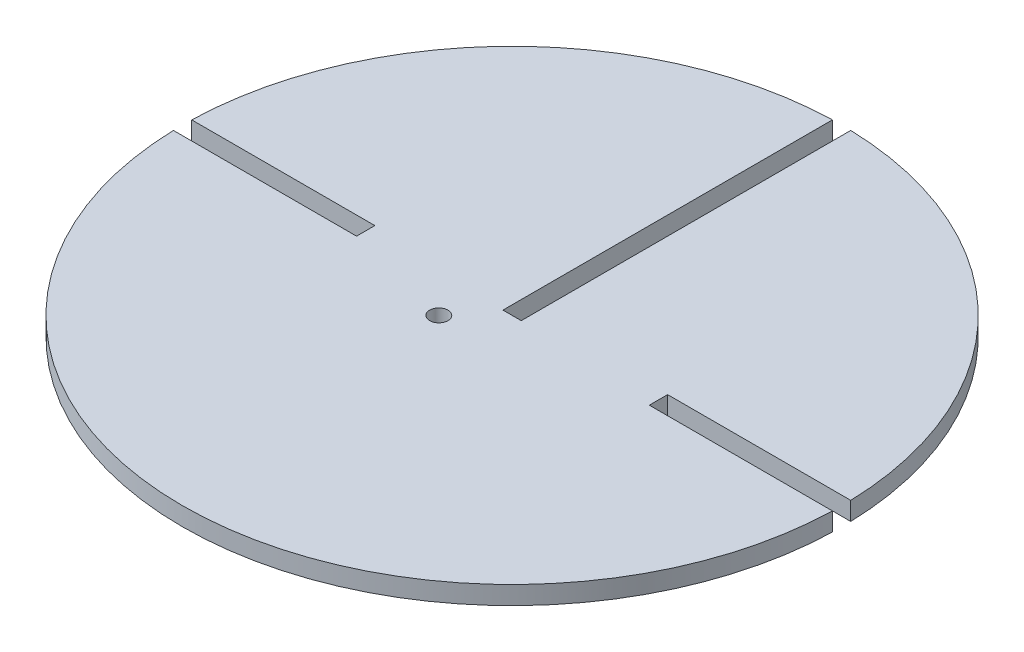
ISO-10303-21;
HEADER;
FILE_DESCRIPTION(('STEP AP214'),'2;1');
FILE_NAME('part.step','',(''),(''),'','','');
FILE_SCHEMA(('AUTOMOTIVE_DESIGN { 1 0 10303 214 1 1 1 1 }'));
ENDSEC;
DATA;
#1=APPLICATION_CONTEXT('core data for automotive mechanical design processes');
#2=APPLICATION_PROTOCOL_DEFINITION('international standard','automotive_design',2000,#1);
#3=PRODUCT_CONTEXT('',#1,'mechanical');
#4=PRODUCT('Part','Part','',(#3));
#5=PRODUCT_RELATED_PRODUCT_CATEGORY('part','',(#4));
#6=PRODUCT_DEFINITION_FORMATION('','',#4);
#7=PRODUCT_DEFINITION_CONTEXT('part definition',#1,'design');
#8=PRODUCT_DEFINITION('design','',#6,#7);
#9=PRODUCT_DEFINITION_SHAPE('','',#8);
#10=(LENGTH_UNIT() NAMED_UNIT(*) SI_UNIT(.MILLI.,.METRE.));
#11=(NAMED_UNIT(*) PLANE_ANGLE_UNIT() SI_UNIT($,.RADIAN.));
#12=(NAMED_UNIT(*) SI_UNIT($,.STERADIAN.) SOLID_ANGLE_UNIT());
#13=UNCERTAINTY_MEASURE_WITH_UNIT(LENGTH_MEASURE(1.E-05),#10,'distance_accuracy_value','');
#14=(GEOMETRIC_REPRESENTATION_CONTEXT(3) GLOBAL_UNCERTAINTY_ASSIGNED_CONTEXT((#13)) GLOBAL_UNIT_ASSIGNED_CONTEXT((#10,
#11,#12)) REPRESENTATION_CONTEXT('',''));
#15=CARTESIAN_POINT('',(0.,0.,0.));
#16=DIRECTION('',(0.,0.,1.));
#17=DIRECTION('',(1.,0.,0.));
#18=AXIS2_PLACEMENT_3D('',#15,#16,#17);
#19=CARTESIAN_POINT('',(0.,6.35,0.));
#20=DIRECTION('',(0.,-1.,0.));
#21=DIRECTION('',(0.,0.,-1.));
#22=AXIS2_PLACEMENT_3D('',#19,#20,#21);
#23=CYLINDRICAL_SURFACE('',#22,114.3);
#24=CARTESIAN_POINT('',(0.,0.,0.));
#25=DIRECTION('',(0.,1.,0.));
#26=DIRECTION('',(0.,0.,1.));
#27=AXIS2_PLACEMENT_3D('',#24,#25,#26);
#28=CIRCLE('',#27,114.3);
#29=CARTESIAN_POINT('',(114.255894268086,0.,-3.175));
#30=VERTEX_POINT('',#29);
#31=CARTESIAN_POINT('',(3.175,0.,-114.255894268086));
#32=VERTEX_POINT('',#31);
#33=EDGE_CURVE('E243',#30,#32,#28,.T.);
#34=ORIENTED_EDGE('',*,*,#33,.T.);
#35=DIRECTION('',(0.,-1.,0.));
#36=VECTOR('',#35,1.);
#37=CARTESIAN_POINT('',(3.175,6.35,-114.255894268086));
#38=LINE('',#37,#36);
#39=CARTESIAN_POINT('',(3.175,6.35,-114.255894268086));
#40=VERTEX_POINT('',#39);
#41=EDGE_CURVE('E136',#32,#40,#38,.F.);
#42=ORIENTED_EDGE('',*,*,#41,.T.);
#43=CARTESIAN_POINT('',(0.,6.35,0.));
#44=DIRECTION('',(0.,1.,0.));
#45=DIRECTION('',(0.,0.,1.));
#46=AXIS2_PLACEMENT_3D('',#43,#44,#45);
#47=CIRCLE('',#46,114.3);
#48=CARTESIAN_POINT('',(114.255894268086,6.35,-3.175));
#49=VERTEX_POINT('',#48);
#50=EDGE_CURVE('E236',#49,#40,#47,.T.);
#51=ORIENTED_EDGE('',*,*,#50,.F.);
#52=DIRECTION('',(0.,-1.,0.));
#53=VECTOR('',#52,1.);
#54=CARTESIAN_POINT('',(114.255894268086,6.35,-3.175));
#55=LINE('',#54,#53);
#56=EDGE_CURVE('E232',#30,#49,#55,.F.);
#57=ORIENTED_EDGE('',*,*,#56,.F.);
#58=EDGE_LOOP('',(#34,#42,#51,#57));
#59=FACE_BOUND('',#58,.T.);
#60=ADVANCED_FACE('F38',(#59),#23,.T.);
#61=CARTESIAN_POINT('',(-3.175,6.35,-114.255894268086));
#62=VERTEX_POINT('',#61);
#63=CARTESIAN_POINT('',(-114.255894268086,6.35,-3.17499999999999));
#64=VERTEX_POINT('',#63);
#65=EDGE_CURVE('E241',#62,#64,#47,.T.);
#66=ORIENTED_EDGE('',*,*,#65,.F.);
#67=DIRECTION('',(0.,-1.,0.));
#68=VECTOR('',#67,1.);
#69=CARTESIAN_POINT('',(-3.175,6.35,-114.255894268086));
#70=LINE('',#69,#68);
#71=CARTESIAN_POINT('',(-3.175,0.,-114.255894268086));
#72=VERTEX_POINT('',#71);
#73=EDGE_CURVE('E148',#62,#72,#70,.T.);
#74=ORIENTED_EDGE('',*,*,#73,.T.);
#75=CARTESIAN_POINT('',(-114.255894268086,0.,-3.17499999999999));
#76=VERTEX_POINT('',#75);
#77=EDGE_CURVE('E246',#72,#76,#28,.T.);
#78=ORIENTED_EDGE('',*,*,#77,.T.);
#79=DIRECTION('',(0.,-1.,0.));
#80=VECTOR('',#79,1.);
#81=CARTESIAN_POINT('',(-114.255894268086,6.35,-3.17499999999999));
#82=LINE('',#81,#80);
#83=EDGE_CURVE('E199',#76,#64,#82,.F.);
#84=ORIENTED_EDGE('',*,*,#83,.T.);
#85=EDGE_LOOP('',(#66,#74,#78,#84));
#86=FACE_BOUND('',#85,.T.);
#87=ADVANCED_FACE('F271',(#86),#23,.T.);
#88=CARTESIAN_POINT('',(-114.255894268086,6.35,3.17500000000001));
#89=VERTEX_POINT('',#88);
#90=CARTESIAN_POINT('',(114.255894268086,6.35,3.175));
#91=VERTEX_POINT('',#90);
#92=EDGE_CURVE('E242',#89,#91,#47,.T.);
#93=ORIENTED_EDGE('',*,*,#92,.F.);
#94=DIRECTION('',(0.,-1.,0.));
#95=VECTOR('',#94,1.);
#96=CARTESIAN_POINT('',(-114.255894268086,6.35,3.17500000000001));
#97=LINE('',#96,#95);
#98=CARTESIAN_POINT('',(-114.255894268086,0.,3.17500000000001));
#99=VERTEX_POINT('',#98);
#100=EDGE_CURVE('E193',#89,#99,#97,.T.);
#101=ORIENTED_EDGE('',*,*,#100,.T.);
#102=CARTESIAN_POINT('',(114.255894268086,0.,3.175));
#103=VERTEX_POINT('',#102);
#104=EDGE_CURVE('E235',#99,#103,#28,.T.);
#105=ORIENTED_EDGE('',*,*,#104,.T.);
#106=DIRECTION('',(0.,-1.,0.));
#107=VECTOR('',#106,1.);
#108=CARTESIAN_POINT('',(114.255894268086,6.35,3.175));
#109=LINE('',#108,#107);
#110=EDGE_CURVE('E228',#103,#91,#109,.F.);
#111=ORIENTED_EDGE('',*,*,#110,.T.);
#112=EDGE_LOOP('',(#93,#101,#105,#111));
#113=FACE_BOUND('',#112,.T.);
#114=ADVANCED_FACE('F40',(#113),#23,.T.);
#115=CARTESIAN_POINT('',(0.,6.35,0.));
#116=DIRECTION('',(0.,1.,0.));
#117=DIRECTION('',(0.,0.,1.));
#118=AXIS2_PLACEMENT_3D('',#115,#116,#117);
#119=PLANE('',#118);
#120=CARTESIAN_POINT('',(-12.7,6.35,12.7));
#121=DIRECTION('',(0.,1.,0.));
#122=DIRECTION('',(0.,0.,1.));
#123=AXIS2_PLACEMENT_3D('',#120,#121,#122);
#124=CIRCLE('',#123,3.175);
#125=CARTESIAN_POINT('',(-12.7,6.35,15.875));
#126=VERTEX_POINT('',#125);
#127=EDGE_CURVE('E424',#126,#126,#124,.T.);
#128=ORIENTED_EDGE('',*,*,#127,.F.);
#129=EDGE_LOOP('',(#128));
#130=FACE_BOUND('',#129,.T.);
#131=DIRECTION('',(0.,0.,-1.));
#132=VECTOR('',#131,1.);
#133=CARTESIAN_POINT('',(3.175,6.35,0.));
#134=LINE('',#133,#132);
#135=CARTESIAN_POINT('',(3.175,6.35,0.));
#136=VERTEX_POINT('',#135);
#137=EDGE_CURVE('E141',#136,#40,#134,.T.);
#138=ORIENTED_EDGE('',*,*,#137,.F.);
#139=DIRECTION('',(1.,0.,0.));
#140=VECTOR('',#139,1.);
#141=CARTESIAN_POINT('',(-3.175,6.35,0.));
#142=LINE('',#141,#140);
#143=CARTESIAN_POINT('',(-3.175,6.35,0.));
#144=VERTEX_POINT('',#143);
#145=EDGE_CURVE('E145',#144,#136,#142,.T.);
#146=ORIENTED_EDGE('',*,*,#145,.F.);
#147=DIRECTION('',(0.,0.,1.));
#148=VECTOR('',#147,1.);
#149=CARTESIAN_POINT('',(-3.175,6.35,0.));
#150=LINE('',#149,#148);
#151=EDGE_CURVE('E159',#62,#144,#150,.T.);
#152=ORIENTED_EDGE('',*,*,#151,.F.);
#153=ORIENTED_EDGE('',*,*,#65,.T.);
#154=DIRECTION('',(-1.,0.,0.));
#155=VECTOR('',#154,1.);
#156=CARTESIAN_POINT('',(-50.7558942680858,6.35,-3.175));
#157=LINE('',#156,#155);
#158=CARTESIAN_POINT('',(-50.7558942680858,6.35,-3.175));
#159=VERTEX_POINT('',#158);
#160=EDGE_CURVE('E177',#159,#64,#157,.T.);
#161=ORIENTED_EDGE('',*,*,#160,.F.);
#162=DIRECTION('',(0.,0.,-1.));
#163=VECTOR('',#162,1.);
#164=CARTESIAN_POINT('',(-50.7558942680858,6.35,3.175));
#165=LINE('',#164,#163);
#166=CARTESIAN_POINT('',(-50.7558942680858,6.35,3.175));
#167=VERTEX_POINT('',#166);
#168=EDGE_CURVE('E183',#167,#159,#165,.T.);
#169=ORIENTED_EDGE('',*,*,#168,.F.);
#170=DIRECTION('',(1.,0.,0.));
#171=VECTOR('',#170,1.);
#172=CARTESIAN_POINT('',(-50.7558942680858,6.35,3.175));
#173=LINE('',#172,#171);
#174=EDGE_CURVE('E172',#89,#167,#173,.T.);
#175=ORIENTED_EDGE('',*,*,#174,.F.);
#176=ORIENTED_EDGE('',*,*,#92,.T.);
#177=DIRECTION('',(1.,0.,0.));
#178=VECTOR('',#177,1.);
#179=CARTESIAN_POINT('',(50.7558942680858,6.35,3.175));
#180=LINE('',#179,#178);
#181=CARTESIAN_POINT('',(50.7558942680858,6.35,3.175));
#182=VERTEX_POINT('',#181);
#183=EDGE_CURVE('E208',#182,#91,#180,.T.);
#184=ORIENTED_EDGE('',*,*,#183,.F.);
#185=DIRECTION('',(0.,0.,-1.));
#186=VECTOR('',#185,1.);
#187=CARTESIAN_POINT('',(50.7558942680858,6.35,3.175));
#188=LINE('',#187,#186);
#189=CARTESIAN_POINT('',(50.7558942680858,6.35,-3.175));
#190=VERTEX_POINT('',#189);
#191=EDGE_CURVE('E203',#182,#190,#188,.T.);
#192=ORIENTED_EDGE('',*,*,#191,.T.);
#193=DIRECTION('',(1.,0.,0.));
#194=VECTOR('',#193,1.);
#195=CARTESIAN_POINT('',(114.255894268086,6.35,-3.175));
#196=LINE('',#195,#194);
#197=EDGE_CURVE('E215',#190,#49,#196,.T.);
#198=ORIENTED_EDGE('',*,*,#197,.T.);
#199=ORIENTED_EDGE('',*,*,#50,.T.);
#200=EDGE_LOOP('',(#138,#146,#152,#153,#161,#169,#175,#176,#184,#192,#198,#199));
#201=FACE_BOUND('',#200,.T.);
#202=ADVANCED_FACE('F265',(#130,#201),#119,.T.);
#203=CARTESIAN_POINT('',(0.,0.,0.));
#204=DIRECTION('',(0.,1.,0.));
#205=DIRECTION('',(0.,0.,1.));
#206=AXIS2_PLACEMENT_3D('',#203,#204,#205);
#207=PLANE('',#206);
#208=CARTESIAN_POINT('',(-12.7,0.,12.7));
#209=DIRECTION('',(0.,1.,0.));
#210=DIRECTION('',(0.,0.,1.));
#211=AXIS2_PLACEMENT_3D('',#208,#209,#210);
#212=CIRCLE('',#211,3.175);
#213=CARTESIAN_POINT('',(-12.7,0.,15.875));
#214=VERTEX_POINT('',#213);
#215=EDGE_CURVE('E162',#214,#214,#212,.T.);
#216=ORIENTED_EDGE('',*,*,#215,.T.);
#217=EDGE_LOOP('',(#216));
#218=FACE_BOUND('',#217,.T.);
#219=DIRECTION('',(1.,0.,0.));
#220=VECTOR('',#219,1.);
#221=CARTESIAN_POINT('',(-3.175,0.,0.));
#222=LINE('',#221,#220);
#223=CARTESIAN_POINT('',(-3.175,0.,0.));
#224=VERTEX_POINT('',#223);
#225=CARTESIAN_POINT('',(3.175,0.,0.));
#226=VERTEX_POINT('',#225);
#227=EDGE_CURVE('E54',#224,#226,#222,.T.);
#228=ORIENTED_EDGE('',*,*,#227,.T.);
#229=DIRECTION('',(0.,0.,-1.));
#230=VECTOR('',#229,1.);
#231=CARTESIAN_POINT('',(3.175,0.,-116.129613814664));
#232=LINE('',#231,#230);
#233=EDGE_CURVE('E131',#226,#32,#232,.T.);
#234=ORIENTED_EDGE('',*,*,#233,.T.);
#235=ORIENTED_EDGE('',*,*,#33,.F.);
#236=DIRECTION('',(1.,0.,0.));
#237=VECTOR('',#236,1.);
#238=CARTESIAN_POINT('',(50.7558942680858,0.,-3.175));
#239=LINE('',#238,#237);
#240=CARTESIAN_POINT('',(50.7558942680858,0.,-3.175));
#241=VERTEX_POINT('',#240);
#242=EDGE_CURVE('E207',#241,#30,#239,.T.);
#243=ORIENTED_EDGE('',*,*,#242,.F.);
#244=DIRECTION('',(0.,0.,-1.));
#245=VECTOR('',#244,1.);
#246=CARTESIAN_POINT('',(50.7558942680858,0.,3.175));
#247=LINE('',#246,#245);
#248=CARTESIAN_POINT('',(50.7558942680858,0.,3.175));
#249=VERTEX_POINT('',#248);
#250=EDGE_CURVE('E204',#249,#241,#247,.T.);
#251=ORIENTED_EDGE('',*,*,#250,.F.);
#252=DIRECTION('',(1.,0.,0.));
#253=VECTOR('',#252,1.);
#254=CARTESIAN_POINT('',(0.,0.,3.175));
#255=LINE('',#254,#253);
#256=EDGE_CURVE('E240',#249,#103,#255,.T.);
#257=ORIENTED_EDGE('',*,*,#256,.T.);
#258=ORIENTED_EDGE('',*,*,#104,.F.);
#259=DIRECTION('',(1.,0.,0.));
#260=VECTOR('',#259,1.);
#261=CARTESIAN_POINT('',(0.,0.,3.17499999999999));
#262=LINE('',#261,#260);
#263=CARTESIAN_POINT('',(-50.7558942680858,0.,3.175));
#264=VERTEX_POINT('',#263);
#265=EDGE_CURVE('E47',#99,#264,#262,.T.);
#266=ORIENTED_EDGE('',*,*,#265,.T.);
#267=DIRECTION('',(0.,0.,-1.));
#268=VECTOR('',#267,1.);
#269=CARTESIAN_POINT('',(-50.7558942680858,0.,3.175));
#270=LINE('',#269,#268);
#271=CARTESIAN_POINT('',(-50.7558942680858,0.,-3.175));
#272=VERTEX_POINT('',#271);
#273=EDGE_CURVE('E62',#264,#272,#270,.T.);
#274=ORIENTED_EDGE('',*,*,#273,.T.);
#275=DIRECTION('',(-1.,0.,0.));
#276=VECTOR('',#275,1.);
#277=CARTESIAN_POINT('',(-120.605894268086,0.,-3.17499999999999));
#278=LINE('',#277,#276);
#279=EDGE_CURVE('E173',#272,#76,#278,.T.);
#280=ORIENTED_EDGE('',*,*,#279,.T.);
#281=ORIENTED_EDGE('',*,*,#77,.F.);
#282=DIRECTION('',(0.,0.,1.));
#283=VECTOR('',#282,1.);
#284=CARTESIAN_POINT('',(-3.175,0.,0.));
#285=LINE('',#284,#283);
#286=EDGE_CURVE('E11',#72,#224,#285,.T.);
#287=ORIENTED_EDGE('',*,*,#286,.T.);
#288=EDGE_LOOP('',(#228,#234,#235,#243,#251,#257,#258,#266,#274,#280,#281,#287));
#289=FACE_BOUND('',#288,.T.);
#290=ADVANCED_FACE('F151',(#218,#289),#207,.F.);
#291=CARTESIAN_POINT('',(114.255894268086,0.,-3.175));
#292=DIRECTION('',(0.,0.,1.));
#293=DIRECTION('',(1.,0.,0.));
#294=AXIS2_PLACEMENT_3D('',#291,#292,#293);
#295=PLANE('',#294);
#296=ORIENTED_EDGE('',*,*,#56,.T.);
#297=ORIENTED_EDGE('',*,*,#197,.F.);
#298=DIRECTION('',(0.,1.,0.));
#299=VECTOR('',#298,1.);
#300=CARTESIAN_POINT('',(50.7558942680858,0.,-3.175));
#301=LINE('',#300,#299);
#302=EDGE_CURVE('E224',#241,#190,#301,.T.);
#303=ORIENTED_EDGE('',*,*,#302,.F.);
#304=ORIENTED_EDGE('',*,*,#242,.T.);
#305=EDGE_LOOP('',(#296,#297,#303,#304));
#306=FACE_BOUND('',#305,.T.);
#307=ADVANCED_FACE('F300',(#306),#295,.T.);
#308=CARTESIAN_POINT('',(50.7558942680858,0.,3.175));
#309=DIRECTION('',(0.,0.,1.));
#310=DIRECTION('',(1.,0.,0.));
#311=AXIS2_PLACEMENT_3D('',#308,#309,#310);
#312=PLANE('',#311);
#313=ORIENTED_EDGE('',*,*,#256,.F.);
#314=DIRECTION('',(0.,1.,0.));
#315=VECTOR('',#314,1.);
#316=CARTESIAN_POINT('',(50.7558942680858,0.,3.175));
#317=LINE('',#316,#315);
#318=EDGE_CURVE('E211',#249,#182,#317,.T.);
#319=ORIENTED_EDGE('',*,*,#318,.T.);
#320=ORIENTED_EDGE('',*,*,#183,.T.);
#321=ORIENTED_EDGE('',*,*,#110,.F.);
#322=EDGE_LOOP('',(#313,#319,#320,#321));
#323=FACE_BOUND('',#322,.T.);
#324=ADVANCED_FACE('F307',(#323),#312,.F.);
#325=CARTESIAN_POINT('',(50.7558942680858,0.,3.175));
#326=DIRECTION('',(1.,0.,0.));
#327=DIRECTION('',(0.,0.,-1.));
#328=AXIS2_PLACEMENT_3D('',#325,#326,#327);
#329=PLANE('',#328);
#330=ORIENTED_EDGE('',*,*,#191,.F.);
#331=ORIENTED_EDGE('',*,*,#318,.F.);
#332=ORIENTED_EDGE('',*,*,#250,.T.);
#333=ORIENTED_EDGE('',*,*,#302,.T.);
#334=EDGE_LOOP('',(#330,#331,#332,#333));
#335=FACE_BOUND('',#334,.T.);
#336=ADVANCED_FACE('F304',(#335),#329,.T.);
#337=CARTESIAN_POINT('',(-50.7558942680858,0.,-3.175));
#338=DIRECTION('',(0.,0.,-1.));
#339=DIRECTION('',(-1.,0.,0.));
#340=AXIS2_PLACEMENT_3D('',#337,#338,#339);
#341=PLANE('',#340);
#342=ORIENTED_EDGE('',*,*,#279,.F.);
#343=DIRECTION('',(0.,1.,0.));
#344=VECTOR('',#343,1.);
#345=CARTESIAN_POINT('',(-50.7558942680858,0.,-3.175));
#346=LINE('',#345,#344);
#347=EDGE_CURVE('E190',#272,#159,#346,.T.);
#348=ORIENTED_EDGE('',*,*,#347,.T.);
#349=ORIENTED_EDGE('',*,*,#160,.T.);
#350=ORIENTED_EDGE('',*,*,#83,.F.);
#351=EDGE_LOOP('',(#342,#348,#349,#350));
#352=FACE_BOUND('',#351,.T.);
#353=ADVANCED_FACE('F270',(#352),#341,.F.);
#354=CARTESIAN_POINT('',(-50.7558942680858,0.,3.175));
#355=DIRECTION('',(0.,0.,1.));
#356=DIRECTION('',(1.,0.,0.));
#357=AXIS2_PLACEMENT_3D('',#354,#355,#356);
#358=PLANE('',#357);
#359=ORIENTED_EDGE('',*,*,#174,.T.);
#360=DIRECTION('',(0.,1.,0.));
#361=VECTOR('',#360,1.);
#362=CARTESIAN_POINT('',(-50.7558942680858,0.,3.175));
#363=LINE('',#362,#361);
#364=EDGE_CURVE('E180',#264,#167,#363,.T.);
#365=ORIENTED_EDGE('',*,*,#364,.F.);
#366=ORIENTED_EDGE('',*,*,#265,.F.);
#367=ORIENTED_EDGE('',*,*,#100,.F.);
#368=EDGE_LOOP('',(#359,#365,#366,#367));
#369=FACE_BOUND('',#368,.T.);
#370=ADVANCED_FACE('F253',(#369),#358,.F.);
#371=CARTESIAN_POINT('',(-50.7558942680858,0.,3.175));
#372=DIRECTION('',(1.,0.,0.));
#373=DIRECTION('',(0.,0.,-1.));
#374=AXIS2_PLACEMENT_3D('',#371,#372,#373);
#375=PLANE('',#374);
#376=ORIENTED_EDGE('',*,*,#168,.T.);
#377=ORIENTED_EDGE('',*,*,#347,.F.);
#378=ORIENTED_EDGE('',*,*,#273,.F.);
#379=ORIENTED_EDGE('',*,*,#364,.T.);
#380=EDGE_LOOP('',(#376,#377,#378,#379));
#381=FACE_BOUND('',#380,.T.);
#382=ADVANCED_FACE('F274',(#381),#375,.F.);
#383=CARTESIAN_POINT('',(3.175,0.,0.));
#384=DIRECTION('',(1.,0.,0.));
#385=DIRECTION('',(0.,0.,-1.));
#386=AXIS2_PLACEMENT_3D('',#383,#384,#385);
#387=PLANE('',#386);
#388=ORIENTED_EDGE('',*,*,#233,.F.);
#389=DIRECTION('',(0.,1.,0.));
#390=VECTOR('',#389,1.);
#391=CARTESIAN_POINT('',(3.175,0.,0.));
#392=LINE('',#391,#390);
#393=EDGE_CURVE('E133',#226,#136,#392,.T.);
#394=ORIENTED_EDGE('',*,*,#393,.T.);
#395=ORIENTED_EDGE('',*,*,#137,.T.);
#396=ORIENTED_EDGE('',*,*,#41,.F.);
#397=EDGE_LOOP('',(#388,#394,#395,#396));
#398=FACE_BOUND('',#397,.T.);
#399=ADVANCED_FACE('F132',(#398),#387,.F.);
#400=CARTESIAN_POINT('',(-3.175,0.,0.));
#401=DIRECTION('',(-1.,0.,0.));
#402=DIRECTION('',(0.,0.,1.));
#403=AXIS2_PLACEMENT_3D('',#400,#401,#402);
#404=PLANE('',#403);
#405=ORIENTED_EDGE('',*,*,#151,.T.);
#406=DIRECTION('',(0.,1.,0.));
#407=VECTOR('',#406,1.);
#408=CARTESIAN_POINT('',(-3.175,0.,0.));
#409=LINE('',#408,#407);
#410=EDGE_CURVE('E149',#224,#144,#409,.T.);
#411=ORIENTED_EDGE('',*,*,#410,.F.);
#412=ORIENTED_EDGE('',*,*,#286,.F.);
#413=ORIENTED_EDGE('',*,*,#73,.F.);
#414=EDGE_LOOP('',(#405,#411,#412,#413));
#415=FACE_BOUND('',#414,.T.);
#416=ADVANCED_FACE('F281',(#415),#404,.F.);
#417=CARTESIAN_POINT('',(-3.175,0.,0.));
#418=DIRECTION('',(0.,0.,1.));
#419=DIRECTION('',(1.,0.,0.));
#420=AXIS2_PLACEMENT_3D('',#417,#418,#419);
#421=PLANE('',#420);
#422=ORIENTED_EDGE('',*,*,#145,.T.);
#423=ORIENTED_EDGE('',*,*,#393,.F.);
#424=ORIENTED_EDGE('',*,*,#227,.F.);
#425=ORIENTED_EDGE('',*,*,#410,.T.);
#426=EDGE_LOOP('',(#422,#423,#424,#425));
#427=FACE_BOUND('',#426,.T.);
#428=ADVANCED_FACE('F143',(#427),#421,.F.);
#429=CARTESIAN_POINT('',(-12.7,0.,12.7));
#430=DIRECTION('',(0.,1.,0.));
#431=DIRECTION('',(0.,0.,1.));
#432=AXIS2_PLACEMENT_3D('',#429,#430,#431);
#433=CYLINDRICAL_SURFACE('',#432,3.175);
#434=ORIENTED_EDGE('',*,*,#215,.F.);
#435=EDGE_LOOP('',(#434));
#436=FACE_BOUND('',#435,.T.);
#437=ORIENTED_EDGE('',*,*,#127,.T.);
#438=EDGE_LOOP('',(#437));
#439=FACE_BOUND('',#438,.T.);
#440=ADVANCED_FACE('F379',(#436,#439),#433,.F.);
#441=CLOSED_SHELL('',(#60,#87,#114,#202,#290,#307,#324,#336,#353,#370,#382,#399,#416,#428,#440));
#442=MANIFOLD_SOLID_BREP('B2',#441);
#443=ADVANCED_BREP_SHAPE_REPRESENTATION('',(#18,#442),#14);
#444=SHAPE_DEFINITION_REPRESENTATION(#9,#443);
ENDSEC;
END-ISO-10303-21;
